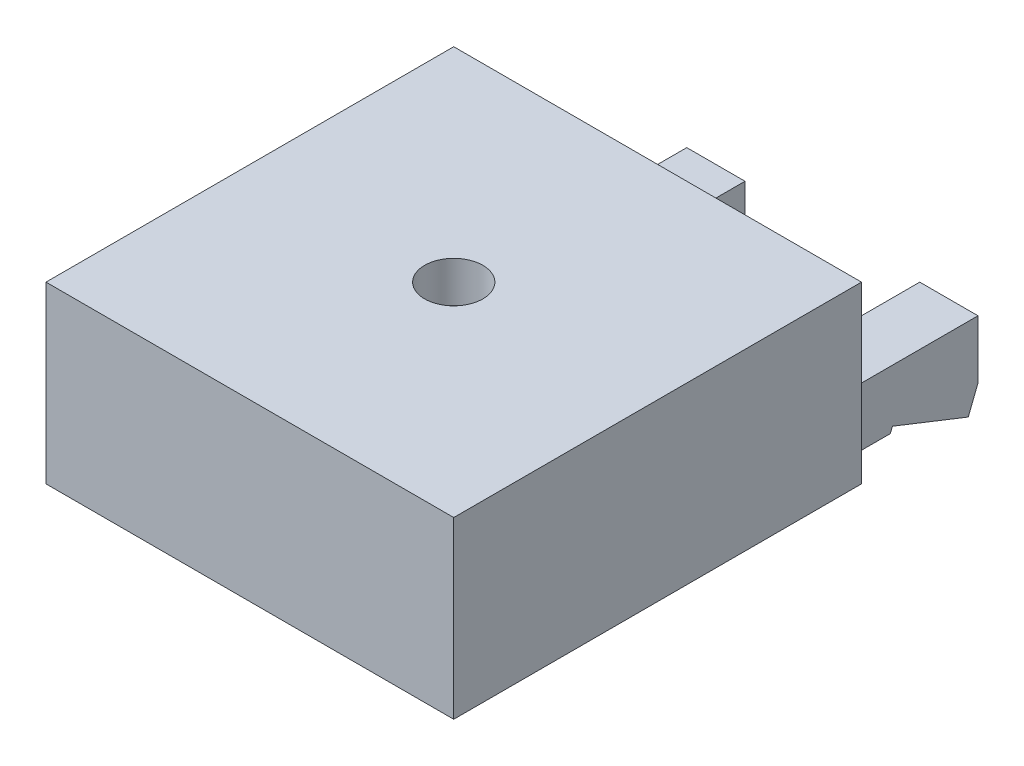
ISO-10303-21;
HEADER;
FILE_DESCRIPTION(('STEP AP214'),'2;1');
FILE_NAME('part.step','',(''),(''),'','','');
FILE_SCHEMA(('AUTOMOTIVE_DESIGN { 1 0 10303 214 1 1 1 1 }'));
ENDSEC;
DATA;
#1=APPLICATION_CONTEXT('core data for automotive mechanical design processes');
#2=APPLICATION_PROTOCOL_DEFINITION('international standard','automotive_design',2000,#1);
#3=PRODUCT_CONTEXT('',#1,'mechanical');
#4=PRODUCT('Part','Part','',(#3));
#5=PRODUCT_RELATED_PRODUCT_CATEGORY('part','',(#4));
#6=PRODUCT_DEFINITION_FORMATION('','',#4);
#7=PRODUCT_DEFINITION_CONTEXT('part definition',#1,'design');
#8=PRODUCT_DEFINITION('design','',#6,#7);
#9=PRODUCT_DEFINITION_SHAPE('','',#8);
#10=(LENGTH_UNIT() NAMED_UNIT(*) SI_UNIT(.MILLI.,.METRE.));
#11=(NAMED_UNIT(*) PLANE_ANGLE_UNIT() SI_UNIT($,.RADIAN.));
#12=(NAMED_UNIT(*) SI_UNIT($,.STERADIAN.) SOLID_ANGLE_UNIT());
#13=UNCERTAINTY_MEASURE_WITH_UNIT(LENGTH_MEASURE(1.E-05),#10,'distance_accuracy_value','');
#14=(GEOMETRIC_REPRESENTATION_CONTEXT(3) GLOBAL_UNCERTAINTY_ASSIGNED_CONTEXT((#13)) GLOBAL_UNIT_ASSIGNED_CONTEXT((#10,
#11,#12)) REPRESENTATION_CONTEXT('',''));
#15=CARTESIAN_POINT('',(0.,0.,0.));
#16=DIRECTION('',(0.,0.,1.));
#17=DIRECTION('',(1.,0.,0.));
#18=AXIS2_PLACEMENT_3D('',#15,#16,#17);
#19=CARTESIAN_POINT('',(0.,30.,-70.));
#20=DIRECTION('',(0.,0.,1.));
#21=DIRECTION('',(1.,0.,0.));
#22=AXIS2_PLACEMENT_3D('',#19,#20,#21);
#23=PLANE('',#22);
#24=DIRECTION('',(0.,1.,0.));
#25=VECTOR('',#24,1.);
#26=CARTESIAN_POINT('',(10.0049669889349,-5.,-70.));
#27=LINE('',#26,#25);
#28=CARTESIAN_POINT('',(10.0049669889349,0.,-70.));
#29=VERTEX_POINT('',#28);
#30=CARTESIAN_POINT('',(10.0049669889349,5.,-70.));
#31=VERTEX_POINT('',#30);
#32=EDGE_CURVE('E262',#29,#31,#27,.T.);
#33=ORIENTED_EDGE('',*,*,#32,.F.);
#34=DIRECTION('',(-1.,0.,0.));
#35=VECTOR('',#34,1.);
#36=CARTESIAN_POINT('',(0.,0.,-70.));
#37=LINE('',#36,#35);
#38=CARTESIAN_POINT('',(0.,0.,-70.));
#39=VERTEX_POINT('',#38);
#40=EDGE_CURVE('E377',#29,#39,#37,.T.);
#41=ORIENTED_EDGE('',*,*,#40,.T.);
#42=DIRECTION('',(0.,-1.,0.));
#43=VECTOR('',#42,1.);
#44=CARTESIAN_POINT('',(0.,30.,-70.));
#45=LINE('',#44,#43);
#46=CARTESIAN_POINT('',(0.,30.,-70.));
#47=VERTEX_POINT('',#46);
#48=EDGE_CURVE('E370',#47,#39,#45,.T.);
#49=ORIENTED_EDGE('',*,*,#48,.F.);
#50=DIRECTION('',(-1.,0.,0.));
#51=VECTOR('',#50,1.);
#52=CARTESIAN_POINT('',(0.,30.,-70.));
#53=LINE('',#52,#51);
#54=CARTESIAN_POINT('',(70.,30.,-70.));
#55=VERTEX_POINT('',#54);
#56=EDGE_CURVE('E368',#55,#47,#53,.T.);
#57=ORIENTED_EDGE('',*,*,#56,.F.);
#58=DIRECTION('',(0.,-1.,0.));
#59=VECTOR('',#58,1.);
#60=CARTESIAN_POINT('',(70.,30.,-70.));
#61=LINE('',#60,#59);
#62=CARTESIAN_POINT('',(70.,0.,-70.));
#63=VERTEX_POINT('',#62);
#64=EDGE_CURVE('E383',#55,#63,#61,.T.);
#65=ORIENTED_EDGE('',*,*,#64,.T.);
#66=CARTESIAN_POINT('',(60.0049669889349,0.,-70.));
#67=VERTEX_POINT('',#66);
#68=EDGE_CURVE('E364',#63,#67,#37,.T.);
#69=ORIENTED_EDGE('',*,*,#68,.T.);
#70=DIRECTION('',(0.,1.,0.));
#71=VECTOR('',#70,1.);
#72=CARTESIAN_POINT('',(60.0049669889349,-5.,-70.));
#73=LINE('',#72,#71);
#74=CARTESIAN_POINT('',(60.0049669889349,5.,-70.));
#75=VERTEX_POINT('',#74);
#76=EDGE_CURVE('E44',#67,#75,#73,.T.);
#77=ORIENTED_EDGE('',*,*,#76,.T.);
#78=DIRECTION('',(-1.,0.,0.));
#79=VECTOR('',#78,1.);
#80=CARTESIAN_POINT('',(50.0049669889349,5.,-70.));
#81=LINE('',#80,#79);
#82=CARTESIAN_POINT('',(50.0049669889349,5.,-70.));
#83=VERTEX_POINT('',#82);
#84=EDGE_CURVE('E297',#75,#83,#81,.T.);
#85=ORIENTED_EDGE('',*,*,#84,.T.);
#86=DIRECTION('',(0.,1.,0.));
#87=VECTOR('',#86,1.);
#88=CARTESIAN_POINT('',(50.0049669889349,-5.,-70.));
#89=LINE('',#88,#87);
#90=CARTESIAN_POINT('',(50.0049669889349,0.,-70.));
#91=VERTEX_POINT('',#90);
#92=EDGE_CURVE('E11',#91,#83,#89,.T.);
#93=ORIENTED_EDGE('',*,*,#92,.F.);
#94=CARTESIAN_POINT('',(20.0049669889349,0.,-70.));
#95=VERTEX_POINT('',#94);
#96=EDGE_CURVE('E408',#91,#95,#37,.T.);
#97=ORIENTED_EDGE('',*,*,#96,.T.);
#98=DIRECTION('',(0.,1.,0.));
#99=VECTOR('',#98,1.);
#100=CARTESIAN_POINT('',(20.0049669889349,-5.,-70.));
#101=LINE('',#100,#99);
#102=CARTESIAN_POINT('',(20.0049669889349,5.,-70.));
#103=VERTEX_POINT('',#102);
#104=EDGE_CURVE('E61',#95,#103,#101,.T.);
#105=ORIENTED_EDGE('',*,*,#104,.T.);
#106=DIRECTION('',(-1.,0.,0.));
#107=VECTOR('',#106,1.);
#108=CARTESIAN_POINT('',(10.0049669889349,5.,-70.));
#109=LINE('',#108,#107);
#110=EDGE_CURVE('E255',#103,#31,#109,.T.);
#111=ORIENTED_EDGE('',*,*,#110,.T.);
#112=EDGE_LOOP('',(#33,#41,#49,#57,#65,#69,#77,#85,#93,#97,#105,#111));
#113=FACE_BOUND('',#112,.T.);
#114=ADVANCED_FACE('F35',(#113),#23,.F.);
#115=CARTESIAN_POINT('',(0.,-5.,0.));
#116=DIRECTION('',(0.,-1.,0.));
#117=DIRECTION('',(0.,0.,-1.));
#118=AXIS2_PLACEMENT_3D('',#115,#116,#117);
#119=PLANE('',#118);
#120=DIRECTION('',(0.964913528572328,0.,-0.262567862424362));
#121=VECTOR('',#120,1.);
#122=CARTESIAN_POINT('',(-18.0655924580302,-5.,-66.3894446314775));
#123=LINE('',#122,#121);
#124=CARTESIAN_POINT('',(50.1305748029924,-5.,-84.9466741997629));
#125=VERTEX_POINT('',#124);
#126=CARTESIAN_POINT('',(50.3265423734166,-5.,-85.));
#127=VERTEX_POINT('',#126);
#128=EDGE_CURVE('E229',#125,#127,#123,.T.);
#129=ORIENTED_EDGE('',*,*,#128,.F.);
#130=DIRECTION('',(1.,0.,0.));
#131=VECTOR('',#130,1.);
#132=CARTESIAN_POINT('',(0.,-5.,-84.9466741997628));
#133=LINE('',#132,#131);
#134=CARTESIAN_POINT('',(60.0049669889349,-5.00000000000001,-84.9466741997629));
#135=VERTEX_POINT('',#134);
#136=EDGE_CURVE('E206',#125,#135,#133,.T.);
#137=ORIENTED_EDGE('',*,*,#136,.T.);
#138=DIRECTION('',(0.,0.,1.));
#139=VECTOR('',#138,1.);
#140=CARTESIAN_POINT('',(60.0049669889349,-5.,-70.));
#141=LINE('',#140,#139);
#142=CARTESIAN_POINT('',(60.0049669889349,-5.,-70.));
#143=VERTEX_POINT('',#142);
#144=EDGE_CURVE('E223',#135,#143,#141,.T.);
#145=ORIENTED_EDGE('',*,*,#144,.T.);
#146=DIRECTION('',(-1.,0.,0.));
#147=VECTOR('',#146,1.);
#148=CARTESIAN_POINT('',(50.0049669889349,-5.,-70.));
#149=LINE('',#148,#147);
#150=CARTESIAN_POINT('',(50.0049669889349,-5.,-70.));
#151=VERTEX_POINT('',#150);
#152=EDGE_CURVE('E300',#143,#151,#149,.T.);
#153=ORIENTED_EDGE('',*,*,#152,.T.);
#154=DIRECTION('',(0.,0.,-1.));
#155=VECTOR('',#154,1.);
#156=CARTESIAN_POINT('',(50.0049669889349,-5.,-70.));
#157=LINE('',#156,#155);
#158=CARTESIAN_POINT('',(50.0049669889349,-5.,-85.));
#159=VERTEX_POINT('',#158);
#160=EDGE_CURVE('E293',#151,#159,#157,.T.);
#161=ORIENTED_EDGE('',*,*,#160,.T.);
#162=DIRECTION('',(1.,0.,0.));
#163=VECTOR('',#162,1.);
#164=CARTESIAN_POINT('',(50.0049669889349,-5.,-85.));
#165=LINE('',#164,#163);
#166=EDGE_CURVE('E288',#159,#127,#165,.T.);
#167=ORIENTED_EDGE('',*,*,#166,.T.);
#168=EDGE_LOOP('',(#129,#137,#145,#153,#161,#167));
#169=FACE_BOUND('',#168,.T.);
#170=ADVANCED_FACE('F436',(#169),#119,.T.);
#171=CARTESIAN_POINT('',(0.,30.,0.));
#172=DIRECTION('',(1.,0.,0.));
#173=DIRECTION('',(0.,0.,-1.));
#174=AXIS2_PLACEMENT_3D('',#171,#172,#173);
#175=PLANE('',#174);
#176=DIRECTION('',(0.,0.,1.));
#177=VECTOR('',#176,1.);
#178=CARTESIAN_POINT('',(0.,0.,0.));
#179=LINE('',#178,#177);
#180=CARTESIAN_POINT('',(0.,0.,0.));
#181=VERTEX_POINT('',#180);
#182=EDGE_CURVE('E353',#39,#181,#179,.T.);
#183=ORIENTED_EDGE('',*,*,#182,.T.);
#184=DIRECTION('',(0.,-1.,0.));
#185=VECTOR('',#184,1.);
#186=CARTESIAN_POINT('',(0.,30.,0.));
#187=LINE('',#186,#185);
#188=CARTESIAN_POINT('',(0.,30.,0.));
#189=VERTEX_POINT('',#188);
#190=EDGE_CURVE('E39',#189,#181,#187,.T.);
#191=ORIENTED_EDGE('',*,*,#190,.F.);
#192=DIRECTION('',(0.,0.,1.));
#193=VECTOR('',#192,1.);
#194=CARTESIAN_POINT('',(0.,30.,0.));
#195=LINE('',#194,#193);
#196=EDGE_CURVE('E360',#47,#189,#195,.T.);
#197=ORIENTED_EDGE('',*,*,#196,.F.);
#198=ORIENTED_EDGE('',*,*,#48,.T.);
#199=EDGE_LOOP('',(#183,#191,#197,#198));
#200=FACE_BOUND('',#199,.T.);
#201=ADVANCED_FACE('F37',(#200),#175,.F.);
#202=CARTESIAN_POINT('',(0.,30.,0.));
#203=DIRECTION('',(0.,0.,-1.));
#204=DIRECTION('',(-1.,0.,0.));
#205=AXIS2_PLACEMENT_3D('',#202,#203,#204);
#206=PLANE('',#205);
#207=DIRECTION('',(1.,0.,0.));
#208=VECTOR('',#207,1.);
#209=CARTESIAN_POINT('',(0.,0.,0.));
#210=LINE('',#209,#208);
#211=CARTESIAN_POINT('',(70.,0.,0.));
#212=VERTEX_POINT('',#211);
#213=EDGE_CURVE('E373',#181,#212,#210,.T.);
#214=ORIENTED_EDGE('',*,*,#213,.T.);
#215=DIRECTION('',(0.,-1.,0.));
#216=VECTOR('',#215,1.);
#217=CARTESIAN_POINT('',(70.,30.,0.));
#218=LINE('',#217,#216);
#219=CARTESIAN_POINT('',(70.,30.,0.));
#220=VERTEX_POINT('',#219);
#221=EDGE_CURVE('E385',#220,#212,#218,.T.);
#222=ORIENTED_EDGE('',*,*,#221,.F.);
#223=DIRECTION('',(1.,0.,0.));
#224=VECTOR('',#223,1.);
#225=CARTESIAN_POINT('',(0.,30.,0.));
#226=LINE('',#225,#224);
#227=EDGE_CURVE('E363',#189,#220,#226,.T.);
#228=ORIENTED_EDGE('',*,*,#227,.F.);
#229=ORIENTED_EDGE('',*,*,#190,.T.);
#230=EDGE_LOOP('',(#214,#222,#228,#229));
#231=FACE_BOUND('',#230,.T.);
#232=ADVANCED_FACE('F418',(#231),#206,.F.);
#233=CARTESIAN_POINT('',(70.,30.,0.));
#234=DIRECTION('',(-1.,0.,0.));
#235=DIRECTION('',(0.,0.,1.));
#236=AXIS2_PLACEMENT_3D('',#233,#234,#235);
#237=PLANE('',#236);
#238=DIRECTION('',(0.,0.,-1.));
#239=VECTOR('',#238,1.);
#240=CARTESIAN_POINT('',(70.,0.,0.));
#241=LINE('',#240,#239);
#242=EDGE_CURVE('E375',#212,#63,#241,.T.);
#243=ORIENTED_EDGE('',*,*,#242,.T.);
#244=ORIENTED_EDGE('',*,*,#64,.F.);
#245=DIRECTION('',(0.,0.,-1.));
#246=VECTOR('',#245,1.);
#247=CARTESIAN_POINT('',(70.,30.,0.));
#248=LINE('',#247,#246);
#249=EDGE_CURVE('E366',#220,#55,#248,.T.);
#250=ORIENTED_EDGE('',*,*,#249,.F.);
#251=ORIENTED_EDGE('',*,*,#221,.T.);
#252=EDGE_LOOP('',(#243,#244,#250,#251));
#253=FACE_BOUND('',#252,.T.);
#254=ADVANCED_FACE('F420',(#253),#237,.F.);
#255=CARTESIAN_POINT('',(0.,30.,0.));
#256=DIRECTION('',(0.,-1.,0.));
#257=DIRECTION('',(0.,0.,-1.));
#258=AXIS2_PLACEMENT_3D('',#255,#256,#257);
#259=PLANE('',#258);
#260=CARTESIAN_POINT('',(35.,30.,-35.));
#261=DIRECTION('',(0.,-1.,0.));
#262=DIRECTION('',(0.,0.,-1.));
#263=AXIS2_PLACEMENT_3D('',#260,#261,#262);
#264=CIRCLE('',#263,5.);
#265=CARTESIAN_POINT('',(35.,30.,-40.));
#266=VERTEX_POINT('',#265);
#267=EDGE_CURVE('E324',#266,#266,#264,.T.);
#268=ORIENTED_EDGE('',*,*,#267,.T.);
#269=EDGE_LOOP('',(#268));
#270=FACE_BOUND('',#269,.T.);
#271=ORIENTED_EDGE('',*,*,#196,.T.);
#272=ORIENTED_EDGE('',*,*,#227,.T.);
#273=ORIENTED_EDGE('',*,*,#249,.T.);
#274=ORIENTED_EDGE('',*,*,#56,.T.);
#275=EDGE_LOOP('',(#271,#272,#273,#274));
#276=FACE_BOUND('',#275,.T.);
#277=ADVANCED_FACE('F422',(#270,#276),#259,.F.);
#278=CARTESIAN_POINT('',(0.,0.,0.));
#279=DIRECTION('',(0.,-1.,0.));
#280=DIRECTION('',(0.,0.,-1.));
#281=AXIS2_PLACEMENT_3D('',#278,#279,#280);
#282=PLANE('',#281);
#283=DIRECTION('',(0.,0.,-1.));
#284=VECTOR('',#283,1.);
#285=CARTESIAN_POINT('',(4.99999999999997,0.,-5.));
#286=LINE('',#285,#284);
#287=CARTESIAN_POINT('',(4.99999999999997,0.,-5.));
#288=VERTEX_POINT('',#287);
#289=CARTESIAN_POINT('',(4.99999999999997,0.,-65.));
#290=VERTEX_POINT('',#289);
#291=EDGE_CURVE('E327',#288,#290,#286,.T.);
#292=ORIENTED_EDGE('',*,*,#291,.F.);
#293=DIRECTION('',(-1.,0.,0.));
#294=VECTOR('',#293,1.);
#295=CARTESIAN_POINT('',(4.99999999999997,0.,-5.));
#296=LINE('',#295,#294);
#297=CARTESIAN_POINT('',(65.,0.,-4.99999999999999));
#298=VERTEX_POINT('',#297);
#299=EDGE_CURVE('E332',#298,#288,#296,.T.);
#300=ORIENTED_EDGE('',*,*,#299,.F.);
#301=DIRECTION('',(0.,0.,1.));
#302=VECTOR('',#301,1.);
#303=CARTESIAN_POINT('',(65.,0.,-4.99999999999999));
#304=LINE('',#303,#302);
#305=CARTESIAN_POINT('',(65.,0.,-65.));
#306=VERTEX_POINT('',#305);
#307=EDGE_CURVE('E346',#306,#298,#304,.T.);
#308=ORIENTED_EDGE('',*,*,#307,.F.);
#309=DIRECTION('',(1.,0.,0.));
#310=VECTOR('',#309,1.);
#311=CARTESIAN_POINT('',(4.99999999999997,0.,-65.));
#312=LINE('',#311,#310);
#313=EDGE_CURVE('E343',#290,#306,#312,.T.);
#314=ORIENTED_EDGE('',*,*,#313,.F.);
#315=EDGE_LOOP('',(#292,#300,#308,#314));
#316=FACE_BOUND('',#315,.T.);
#317=ORIENTED_EDGE('',*,*,#182,.F.);
#318=ORIENTED_EDGE('',*,*,#40,.F.);
#319=EDGE_CURVE('E409',#95,#29,#37,.T.);
#320=ORIENTED_EDGE('',*,*,#319,.F.);
#321=ORIENTED_EDGE('',*,*,#96,.F.);
#322=EDGE_CURVE('E380',#67,#91,#37,.T.);
#323=ORIENTED_EDGE('',*,*,#322,.F.);
#324=ORIENTED_EDGE('',*,*,#68,.F.);
#325=ORIENTED_EDGE('',*,*,#242,.F.);
#326=ORIENTED_EDGE('',*,*,#213,.F.);
#327=EDGE_LOOP('',(#317,#318,#320,#321,#323,#324,#325,#326));
#328=FACE_BOUND('',#327,.T.);
#329=ADVANCED_FACE('F407',(#316,#328),#282,.T.);
#330=CARTESIAN_POINT('',(4.99999999999997,23.,-5.));
#331=DIRECTION('',(-1.,0.,0.));
#332=DIRECTION('',(0.,0.,1.));
#333=AXIS2_PLACEMENT_3D('',#330,#331,#332);
#334=PLANE('',#333);
#335=ORIENTED_EDGE('',*,*,#291,.T.);
#336=DIRECTION('',(0.,-1.,0.));
#337=VECTOR('',#336,1.);
#338=CARTESIAN_POINT('',(4.99999999999997,23.,-65.));
#339=LINE('',#338,#337);
#340=CARTESIAN_POINT('',(4.99999999999997,23.,-65.));
#341=VERTEX_POINT('',#340);
#342=EDGE_CURVE('E341',#341,#290,#339,.T.);
#343=ORIENTED_EDGE('',*,*,#342,.F.);
#344=DIRECTION('',(0.,0.,-1.));
#345=VECTOR('',#344,1.);
#346=CARTESIAN_POINT('',(4.99999999999997,23.,-5.));
#347=LINE('',#346,#345);
#348=CARTESIAN_POINT('',(4.99999999999997,23.,-5.));
#349=VERTEX_POINT('',#348);
#350=EDGE_CURVE('E328',#349,#341,#347,.T.);
#351=ORIENTED_EDGE('',*,*,#350,.F.);
#352=DIRECTION('',(0.,-1.,0.));
#353=VECTOR('',#352,1.);
#354=CARTESIAN_POINT('',(4.99999999999997,23.,-5.));
#355=LINE('',#354,#353);
#356=EDGE_CURVE('E351',#349,#288,#355,.T.);
#357=ORIENTED_EDGE('',*,*,#356,.T.);
#358=EDGE_LOOP('',(#335,#343,#351,#357));
#359=FACE_BOUND('',#358,.T.);
#360=ADVANCED_FACE('F430',(#359),#334,.F.);
#361=CARTESIAN_POINT('',(4.99999999999997,23.,-5.));
#362=DIRECTION('',(0.,0.,1.));
#363=DIRECTION('',(1.,0.,0.));
#364=AXIS2_PLACEMENT_3D('',#361,#362,#363);
#365=PLANE('',#364);
#366=ORIENTED_EDGE('',*,*,#299,.T.);
#367=ORIENTED_EDGE('',*,*,#356,.F.);
#368=DIRECTION('',(-1.,0.,0.));
#369=VECTOR('',#368,1.);
#370=CARTESIAN_POINT('',(4.99999999999997,23.,-5.));
#371=LINE('',#370,#369);
#372=CARTESIAN_POINT('',(65.,23.,-4.99999999999999));
#373=VERTEX_POINT('',#372);
#374=EDGE_CURVE('E338',#373,#349,#371,.T.);
#375=ORIENTED_EDGE('',*,*,#374,.F.);
#376=DIRECTION('',(0.,-1.,0.));
#377=VECTOR('',#376,1.);
#378=CARTESIAN_POINT('',(65.,23.,-4.99999999999999));
#379=LINE('',#378,#377);
#380=EDGE_CURVE('E354',#373,#298,#379,.T.);
#381=ORIENTED_EDGE('',*,*,#380,.T.);
#382=EDGE_LOOP('',(#366,#367,#375,#381));
#383=FACE_BOUND('',#382,.T.);
#384=ADVANCED_FACE('F575',(#383),#365,.F.);
#385=CARTESIAN_POINT('',(65.,23.,-4.99999999999999));
#386=DIRECTION('',(1.,0.,0.));
#387=DIRECTION('',(0.,0.,-1.));
#388=AXIS2_PLACEMENT_3D('',#385,#386,#387);
#389=PLANE('',#388);
#390=ORIENTED_EDGE('',*,*,#307,.T.);
#391=ORIENTED_EDGE('',*,*,#380,.F.);
#392=DIRECTION('',(0.,0.,1.));
#393=VECTOR('',#392,1.);
#394=CARTESIAN_POINT('',(65.,23.,-4.99999999999999));
#395=LINE('',#394,#393);
#396=CARTESIAN_POINT('',(65.,23.,-65.));
#397=VERTEX_POINT('',#396);
#398=EDGE_CURVE('E335',#397,#373,#395,.T.);
#399=ORIENTED_EDGE('',*,*,#398,.F.);
#400=DIRECTION('',(0.,-1.,0.));
#401=VECTOR('',#400,1.);
#402=CARTESIAN_POINT('',(65.,23.,-65.));
#403=LINE('',#402,#401);
#404=EDGE_CURVE('E356',#397,#306,#403,.T.);
#405=ORIENTED_EDGE('',*,*,#404,.T.);
#406=EDGE_LOOP('',(#390,#391,#399,#405));
#407=FACE_BOUND('',#406,.T.);
#408=ADVANCED_FACE('F578',(#407),#389,.F.);
#409=CARTESIAN_POINT('',(4.99999999999997,23.,-65.));
#410=DIRECTION('',(0.,0.,-1.));
#411=DIRECTION('',(-1.,0.,0.));
#412=AXIS2_PLACEMENT_3D('',#409,#410,#411);
#413=PLANE('',#412);
#414=ORIENTED_EDGE('',*,*,#313,.T.);
#415=ORIENTED_EDGE('',*,*,#404,.F.);
#416=DIRECTION('',(1.,0.,0.));
#417=VECTOR('',#416,1.);
#418=CARTESIAN_POINT('',(4.99999999999997,23.,-65.));
#419=LINE('',#418,#417);
#420=EDGE_CURVE('E331',#341,#397,#419,.T.);
#421=ORIENTED_EDGE('',*,*,#420,.F.);
#422=ORIENTED_EDGE('',*,*,#342,.T.);
#423=EDGE_LOOP('',(#414,#415,#421,#422));
#424=FACE_BOUND('',#423,.T.);
#425=ADVANCED_FACE('F573',(#424),#413,.F.);
#426=CARTESIAN_POINT('',(0.,23.,0.));
#427=DIRECTION('',(0.,-1.,0.));
#428=DIRECTION('',(0.,0.,-1.));
#429=AXIS2_PLACEMENT_3D('',#426,#427,#428);
#430=PLANE('',#429);
#431=CARTESIAN_POINT('',(35.,23.,-35.));
#432=DIRECTION('',(0.,-1.,0.));
#433=DIRECTION('',(0.,0.,-1.));
#434=AXIS2_PLACEMENT_3D('',#431,#432,#433);
#435=CIRCLE('',#434,5.);
#436=CARTESIAN_POINT('',(35.,23.,-40.));
#437=VERTEX_POINT('',#436);
#438=EDGE_CURVE('E321',#437,#437,#435,.T.);
#439=ORIENTED_EDGE('',*,*,#438,.F.);
#440=EDGE_LOOP('',(#439));
#441=FACE_BOUND('',#440,.T.);
#442=ORIENTED_EDGE('',*,*,#350,.T.);
#443=ORIENTED_EDGE('',*,*,#420,.T.);
#444=ORIENTED_EDGE('',*,*,#398,.T.);
#445=ORIENTED_EDGE('',*,*,#374,.T.);
#446=EDGE_LOOP('',(#442,#443,#444,#445));
#447=FACE_BOUND('',#446,.T.);
#448=ADVANCED_FACE('F569',(#441,#447),#430,.T.);
#449=CARTESIAN_POINT('',(35.,46.,-35.));
#450=DIRECTION('',(0.,-1.,0.));
#451=DIRECTION('',(0.,0.,-1.));
#452=AXIS2_PLACEMENT_3D('',#449,#450,#451);
#453=CYLINDRICAL_SURFACE('',#452,5.);
#454=ORIENTED_EDGE('',*,*,#438,.T.);
#455=EDGE_LOOP('',(#454));
#456=FACE_BOUND('',#455,.T.);
#457=ORIENTED_EDGE('',*,*,#267,.F.);
#458=EDGE_LOOP('',(#457));
#459=FACE_BOUND('',#458,.T.);
#460=ADVANCED_FACE('F563',(#456,#459),#453,.F.);
#461=CARTESIAN_POINT('',(50.0049669889349,-5.,-70.));
#462=DIRECTION('',(0.,0.,-1.));
#463=DIRECTION('',(-1.,0.,0.));
#464=AXIS2_PLACEMENT_3D('',#461,#462,#463);
#465=PLANE('',#464);
#466=EDGE_CURVE('E312',#143,#67,#73,.T.);
#467=ORIENTED_EDGE('',*,*,#466,.T.);
#468=ORIENTED_EDGE('',*,*,#322,.T.);
#469=EDGE_CURVE('E46',#151,#91,#89,.T.);
#470=ORIENTED_EDGE('',*,*,#469,.F.);
#471=ORIENTED_EDGE('',*,*,#152,.F.);
#472=EDGE_LOOP('',(#467,#468,#470,#471));
#473=FACE_BOUND('',#472,.T.);
#474=ADVANCED_FACE('F402',(#473),#465,.F.);
#475=CARTESIAN_POINT('',(50.0049669889349,-5.,-70.));
#476=DIRECTION('',(1.,0.,0.));
#477=DIRECTION('',(0.,0.,-1.));
#478=AXIS2_PLACEMENT_3D('',#475,#476,#477);
#479=PLANE('',#478);
#480=DIRECTION('',(0.,0.,-1.));
#481=VECTOR('',#480,1.);
#482=CARTESIAN_POINT('',(50.0049669889349,5.,-70.));
#483=LINE('',#482,#481);
#484=CARTESIAN_POINT('',(50.0049669889349,5.,-100.));
#485=VERTEX_POINT('',#484);
#486=EDGE_CURVE('E292',#83,#485,#483,.T.);
#487=ORIENTED_EDGE('',*,*,#486,.T.);
#488=DIRECTION('',(0.,1.,0.));
#489=VECTOR('',#488,1.);
#490=CARTESIAN_POINT('',(50.0049669889349,-5.,-100.));
#491=LINE('',#490,#489);
#492=CARTESIAN_POINT('',(50.0049669889349,-5.,-100.));
#493=VERTEX_POINT('',#492);
#494=EDGE_CURVE('E318',#493,#485,#491,.T.);
#495=ORIENTED_EDGE('',*,*,#494,.F.);
#496=DIRECTION('',(0.,-0.930027037598525,0.367491101029279));
#497=VECTOR('',#496,1.);
#498=CARTESIAN_POINT('',(50.0049669889349,-34.8529145500866,-88.2039123665993));
#499=LINE('',#498,#497);
#500=CARTESIAN_POINT('',(50.0049669889349,-10.1565572807306,-97.9624367507536));
#501=VERTEX_POINT('',#500);
#502=EDGE_CURVE('E285',#493,#501,#499,.T.);
#503=ORIENTED_EDGE('',*,*,#502,.T.);
#504=DIRECTION('',(0.,0.369633954876696,0.929177453128418));
#505=VECTOR('',#504,1.);
#506=CARTESIAN_POINT('',(50.0049669889349,24.8768669294685,-9.89620946690133));
#507=LINE('',#506,#505);
#508=EDGE_CURVE('E283',#501,#159,#507,.T.);
#509=ORIENTED_EDGE('',*,*,#508,.T.);
#510=ORIENTED_EDGE('',*,*,#160,.F.);
#511=ORIENTED_EDGE('',*,*,#469,.T.);
#512=ORIENTED_EDGE('',*,*,#92,.T.);
#513=EDGE_LOOP('',(#487,#495,#503,#509,#510,#511,#512));
#514=FACE_BOUND('',#513,.T.);
#515=ADVANCED_FACE('F466',(#514),#479,.F.);
#516=CARTESIAN_POINT('',(50.0049669889349,-5.,-100.));
#517=DIRECTION('',(0.,0.,1.));
#518=DIRECTION('',(1.,0.,0.));
#519=AXIS2_PLACEMENT_3D('',#516,#517,#518);
#520=PLANE('',#519);
#521=DIRECTION('',(1.,0.,0.));
#522=VECTOR('',#521,1.);
#523=CARTESIAN_POINT('',(50.0049669889349,5.,-100.));
#524=LINE('',#523,#522);
#525=CARTESIAN_POINT('',(60.0049669889349,5.,-100.));
#526=VERTEX_POINT('',#525);
#527=EDGE_CURVE('E304',#485,#526,#524,.T.);
#528=ORIENTED_EDGE('',*,*,#527,.T.);
#529=DIRECTION('',(0.,1.,0.));
#530=VECTOR('',#529,1.);
#531=CARTESIAN_POINT('',(60.0049669889349,-5.,-100.));
#532=LINE('',#531,#530);
#533=CARTESIAN_POINT('',(60.0049669889349,-5.,-100.));
#534=VERTEX_POINT('',#533);
#535=EDGE_CURVE('E315',#534,#526,#532,.T.);
#536=ORIENTED_EDGE('',*,*,#535,.F.);
#537=DIRECTION('',(1.,0.,0.));
#538=VECTOR('',#537,1.);
#539=CARTESIAN_POINT('',(50.0049669889349,-5.,-100.));
#540=LINE('',#539,#538);
#541=EDGE_CURVE('E296',#493,#534,#540,.T.);
#542=ORIENTED_EDGE('',*,*,#541,.F.);
#543=ORIENTED_EDGE('',*,*,#494,.T.);
#544=EDGE_LOOP('',(#528,#536,#542,#543));
#545=FACE_BOUND('',#544,.T.);
#546=ADVANCED_FACE('F470',(#545),#520,.F.);
#547=CARTESIAN_POINT('',(60.0049669889349,-5.,-70.));
#548=DIRECTION('',(-1.,0.,0.));
#549=DIRECTION('',(0.,0.,1.));
#550=AXIS2_PLACEMENT_3D('',#547,#548,#549);
#551=PLANE('',#550);
#552=DIRECTION('',(0.,-0.930027037598525,0.367491101029278));
#553=VECTOR('',#552,1.);
#554=CARTESIAN_POINT('',(60.0049669889349,-4.08165482872218,-85.3095493254036));
#555=LINE('',#554,#553);
#556=CARTESIAN_POINT('',(60.0049669889349,-4.08165482872218,-85.3095493254036));
#557=VERTEX_POINT('',#556);
#558=EDGE_CURVE('E204',#557,#135,#555,.T.);
#559=ORIENTED_EDGE('',*,*,#558,.F.);
#560=DIRECTION('',(0.,-0.367491101029279,-0.930027037598525));
#561=VECTOR('',#560,1.);
#562=CARTESIAN_POINT('',(60.0049669889349,-4.08165482872218,-85.3095493254036));
#563=LINE('',#562,#561);
#564=CARTESIAN_POINT('',(60.0049669889349,-9.22653024313209,-98.3299278517829));
#565=VERTEX_POINT('',#564);
#566=EDGE_CURVE('E212',#557,#565,#563,.T.);
#567=ORIENTED_EDGE('',*,*,#566,.T.);
#568=DIRECTION('',(0.,-0.930027037598525,0.367491101029279));
#569=VECTOR('',#568,1.);
#570=CARTESIAN_POINT('',(60.0049669889349,-34.8529145500866,-88.2039123665993));
#571=LINE('',#570,#569);
#572=EDGE_CURVE('E282',#534,#565,#571,.T.);
#573=ORIENTED_EDGE('',*,*,#572,.F.);
#574=ORIENTED_EDGE('',*,*,#535,.T.);
#575=DIRECTION('',(0.,0.,1.));
#576=VECTOR('',#575,1.);
#577=CARTESIAN_POINT('',(60.0049669889349,5.,-70.));
#578=LINE('',#577,#576);
#579=EDGE_CURVE('E306',#526,#75,#578,.T.);
#580=ORIENTED_EDGE('',*,*,#579,.T.);
#581=ORIENTED_EDGE('',*,*,#76,.F.);
#582=ORIENTED_EDGE('',*,*,#466,.F.);
#583=ORIENTED_EDGE('',*,*,#144,.F.);
#584=EDGE_LOOP('',(#559,#567,#573,#574,#580,#581,#582,#583));
#585=FACE_BOUND('',#584,.T.);
#586=ADVANCED_FACE('F221',(#585),#551,.F.);
#587=CARTESIAN_POINT('',(0.,5.,0.));
#588=DIRECTION('',(0.,-1.,0.));
#589=DIRECTION('',(0.,0.,-1.));
#590=AXIS2_PLACEMENT_3D('',#587,#588,#589);
#591=PLANE('',#590);
#592=ORIENTED_EDGE('',*,*,#486,.F.);
#593=ORIENTED_EDGE('',*,*,#84,.F.);
#594=ORIENTED_EDGE('',*,*,#579,.F.);
#595=ORIENTED_EDGE('',*,*,#527,.F.);
#596=EDGE_LOOP('',(#592,#593,#594,#595));
#597=FACE_BOUND('',#596,.T.);
#598=ADVANCED_FACE('F483',(#597),#591,.F.);
#599=CARTESIAN_POINT('',(50.0049669889349,24.8768669294685,-9.89620946690133));
#600=DIRECTION('',(0.,0.929177453128418,-0.369633954876696));
#601=DIRECTION('',(0.,0.369633954876696,0.929177453128418));
#602=AXIS2_PLACEMENT_3D('',#599,#600,#601);
#603=PLANE('',#602);
#604=ORIENTED_EDGE('',*,*,#508,.F.);
#605=DIRECTION('',(0.023045145648647,0.369535789474442,0.92893068716645));
#606=VECTOR('',#605,1.);
#607=CARTESIAN_POINT('',(52.1885757755975,24.8582614227523,-9.94297956774478));
#608=LINE('',#607,#606);
#609=EDGE_CURVE('E218',#501,#127,#608,.T.);
#610=ORIENTED_EDGE('',*,*,#609,.T.);
#611=ORIENTED_EDGE('',*,*,#166,.F.);
#612=EDGE_LOOP('',(#604,#610,#611));
#613=FACE_BOUND('',#612,.T.);
#614=ADVANCED_FACE('F491',(#613),#603,.F.);
#615=CARTESIAN_POINT('',(50.0049669889349,-34.8529145500866,-88.2039123665993));
#616=DIRECTION('',(0.,0.367491101029279,0.930027037598525));
#617=DIRECTION('',(0.,-0.930027037598525,0.367491101029279));
#618=AXIS2_PLACEMENT_3D('',#615,#616,#617);
#619=PLANE('',#618);
#620=ORIENTED_EDGE('',*,*,#572,.T.);
#621=DIRECTION('',(0.995037190209989,0.0925411490311359,-0.036566731259535));
#622=VECTOR('',#621,1.);
#623=CARTESIAN_POINT('',(50.0049669889349,-10.1565572807306,-97.9624367507537));
#624=LINE('',#623,#622);
#625=EDGE_CURVE('E209',#501,#565,#624,.T.);
#626=ORIENTED_EDGE('',*,*,#625,.F.);
#627=ORIENTED_EDGE('',*,*,#502,.F.);
#628=ORIENTED_EDGE('',*,*,#541,.T.);
#629=EDGE_LOOP('',(#620,#626,#627,#628));
#630=FACE_BOUND('',#629,.T.);
#631=ADVANCED_FACE('F495',(#630),#619,.F.);
#632=CARTESIAN_POINT('',(10.0049669889349,-5.,-70.));
#633=DIRECTION('',(1.,0.,0.));
#634=DIRECTION('',(0.,0.,-1.));
#635=AXIS2_PLACEMENT_3D('',#632,#633,#634);
#636=PLANE('',#635);
#637=DIRECTION('',(0.,0.,-1.));
#638=VECTOR('',#637,1.);
#639=CARTESIAN_POINT('',(10.0049669889349,5.,-70.));
#640=LINE('',#639,#638);
#641=CARTESIAN_POINT('',(10.0049669889349,5.,-100.));
#642=VERTEX_POINT('',#641);
#643=EDGE_CURVE('E251',#31,#642,#640,.T.);
#644=ORIENTED_EDGE('',*,*,#643,.T.);
#645=DIRECTION('',(0.,1.,0.));
#646=VECTOR('',#645,1.);
#647=CARTESIAN_POINT('',(10.0049669889349,-5.,-100.));
#648=LINE('',#647,#646);
#649=CARTESIAN_POINT('',(10.0049669889349,-5.,-100.));
#650=VERTEX_POINT('',#649);
#651=EDGE_CURVE('E279',#650,#642,#648,.T.);
#652=ORIENTED_EDGE('',*,*,#651,.F.);
#653=DIRECTION('',(0.,-0.930147282116257,0.367186646777549));
#654=VECTOR('',#653,1.);
#655=CARTESIAN_POINT('',(10.0049669889349,-5.,-100.));
#656=LINE('',#655,#654);
#657=CARTESIAN_POINT('',(10.0049669889349,-15.2316201032788,-95.960946885447));
#658=VERTEX_POINT('',#657);
#659=EDGE_CURVE('E239',#650,#658,#656,.T.);
#660=ORIENTED_EDGE('',*,*,#659,.T.);
#661=DIRECTION('',(0.,0.682368256322876,0.731008592810561));
#662=VECTOR('',#661,1.);
#663=CARTESIAN_POINT('',(10.0049669889349,-15.2316201032788,-95.960946885447));
#664=LINE('',#663,#662);
#665=CARTESIAN_POINT('',(10.0049669889349,-5.,-85.));
#666=VERTEX_POINT('',#665);
#667=EDGE_CURVE('E243',#658,#666,#664,.T.);
#668=ORIENTED_EDGE('',*,*,#667,.T.);
#669=DIRECTION('',(0.,0.,-1.));
#670=VECTOR('',#669,1.);
#671=CARTESIAN_POINT('',(10.0049669889349,-5.,-70.));
#672=LINE('',#671,#670);
#673=CARTESIAN_POINT('',(10.0049669889349,-5.,-70.));
#674=VERTEX_POINT('',#673);
#675=EDGE_CURVE('E252',#674,#666,#672,.T.);
#676=ORIENTED_EDGE('',*,*,#675,.F.);
#677=EDGE_CURVE('E270',#674,#29,#27,.T.);
#678=ORIENTED_EDGE('',*,*,#677,.T.);
#679=ORIENTED_EDGE('',*,*,#32,.T.);
#680=EDGE_LOOP('',(#644,#652,#660,#668,#676,#678,#679));
#681=FACE_BOUND('',#680,.T.);
#682=ADVANCED_FACE('F506',(#681),#636,.F.);
#683=CARTESIAN_POINT('',(10.0049669889349,-5.,-100.));
#684=DIRECTION('',(0.,0.,1.));
#685=DIRECTION('',(1.,0.,0.));
#686=AXIS2_PLACEMENT_3D('',#683,#684,#685);
#687=PLANE('',#686);
#688=DIRECTION('',(1.,0.,0.));
#689=VECTOR('',#688,1.);
#690=CARTESIAN_POINT('',(10.0049669889349,5.,-100.));
#691=LINE('',#690,#689);
#692=CARTESIAN_POINT('',(20.0049669889349,5.,-100.));
#693=VERTEX_POINT('',#692);
#694=EDGE_CURVE('E265',#642,#693,#691,.T.);
#695=ORIENTED_EDGE('',*,*,#694,.T.);
#696=DIRECTION('',(0.,1.,0.));
#697=VECTOR('',#696,1.);
#698=CARTESIAN_POINT('',(20.0049669889349,-5.,-100.));
#699=LINE('',#698,#697);
#700=CARTESIAN_POINT('',(20.0049669889349,-5.,-100.));
#701=VERTEX_POINT('',#700);
#702=EDGE_CURVE('E276',#701,#693,#699,.T.);
#703=ORIENTED_EDGE('',*,*,#702,.F.);
#704=DIRECTION('',(1.,0.,0.));
#705=VECTOR('',#704,1.);
#706=CARTESIAN_POINT('',(10.0049669889349,-5.,-100.));
#707=LINE('',#706,#705);
#708=EDGE_CURVE('E254',#650,#701,#707,.T.);
#709=ORIENTED_EDGE('',*,*,#708,.F.);
#710=ORIENTED_EDGE('',*,*,#651,.T.);
#711=EDGE_LOOP('',(#695,#703,#709,#710));
#712=FACE_BOUND('',#711,.T.);
#713=ADVANCED_FACE('F554',(#712),#687,.F.);
#714=CARTESIAN_POINT('',(20.0049669889349,-5.,-70.));
#715=DIRECTION('',(-1.,0.,0.));
#716=DIRECTION('',(0.,0.,1.));
#717=AXIS2_PLACEMENT_3D('',#714,#715,#716);
#718=PLANE('',#717);
#719=DIRECTION('',(0.,0.682368256322876,0.731008592810561));
#720=VECTOR('',#719,1.);
#721=CARTESIAN_POINT('',(20.0049669889349,-15.2316201032788,-95.960946885447));
#722=LINE('',#721,#720);
#723=CARTESIAN_POINT('',(20.0049669889349,-13.3686836575018,-93.9652172525044));
#724=VERTEX_POINT('',#723);
#725=CARTESIAN_POINT('',(20.0049669889349,-5.,-85.));
#726=VERTEX_POINT('',#725);
#727=EDGE_CURVE('E53',#724,#726,#722,.T.);
#728=ORIENTED_EDGE('',*,*,#727,.F.);
#729=DIRECTION('',(0.,-0.367186646777549,-0.930147282116257));
#730=VECTOR('',#729,1.);
#731=CARTESIAN_POINT('',(20.0049669889349,-10.6296063533871,-87.0266607110619));
#732=LINE('',#731,#730);
#733=CARTESIAN_POINT('',(20.0049669889349,-14.3014728211626,-96.3281335322245));
#734=VERTEX_POINT('',#733);
#735=EDGE_CURVE('E234',#724,#734,#732,.T.);
#736=ORIENTED_EDGE('',*,*,#735,.T.);
#737=DIRECTION('',(0.,-0.930147282116257,0.367186646777549));
#738=VECTOR('',#737,1.);
#739=CARTESIAN_POINT('',(20.0049669889349,-5.,-100.));
#740=LINE('',#739,#738);
#741=EDGE_CURVE('E240',#701,#734,#740,.T.);
#742=ORIENTED_EDGE('',*,*,#741,.F.);
#743=ORIENTED_EDGE('',*,*,#702,.T.);
#744=DIRECTION('',(0.,0.,1.));
#745=VECTOR('',#744,1.);
#746=CARTESIAN_POINT('',(20.0049669889349,5.,-70.));
#747=LINE('',#746,#745);
#748=EDGE_CURVE('E267',#693,#103,#747,.T.);
#749=ORIENTED_EDGE('',*,*,#748,.T.);
#750=ORIENTED_EDGE('',*,*,#104,.F.);
#751=CARTESIAN_POINT('',(20.0049669889349,-5.,-70.));
#752=VERTEX_POINT('',#751);
#753=EDGE_CURVE('E273',#752,#95,#101,.T.);
#754=ORIENTED_EDGE('',*,*,#753,.F.);
#755=DIRECTION('',(0.,0.,1.));
#756=VECTOR('',#755,1.);
#757=CARTESIAN_POINT('',(20.0049669889349,-5.,-70.));
#758=LINE('',#757,#756);
#759=EDGE_CURVE('E258',#726,#752,#758,.T.);
#760=ORIENTED_EDGE('',*,*,#759,.F.);
#761=EDGE_LOOP('',(#728,#736,#742,#743,#749,#750,#754,#760));
#762=FACE_BOUND('',#761,.T.);
#763=ADVANCED_FACE('F551',(#762),#718,.F.);
#764=CARTESIAN_POINT('',(10.0049669889349,-5.,-70.));
#765=DIRECTION('',(0.,0.,-1.));
#766=DIRECTION('',(-1.,0.,0.));
#767=AXIS2_PLACEMENT_3D('',#764,#765,#766);
#768=PLANE('',#767);
#769=ORIENTED_EDGE('',*,*,#319,.T.);
#770=ORIENTED_EDGE('',*,*,#677,.F.);
#771=DIRECTION('',(-1.,0.,0.));
#772=VECTOR('',#771,1.);
#773=CARTESIAN_POINT('',(10.0049669889349,-5.,-70.));
#774=LINE('',#773,#772);
#775=EDGE_CURVE('E260',#752,#674,#774,.T.);
#776=ORIENTED_EDGE('',*,*,#775,.F.);
#777=ORIENTED_EDGE('',*,*,#753,.T.);
#778=EDGE_LOOP('',(#769,#770,#776,#777));
#779=FACE_BOUND('',#778,.T.);
#780=ADVANCED_FACE('F544',(#779),#768,.F.);
#781=CARTESIAN_POINT('',(0.,-5.,0.));
#782=DIRECTION('',(0.,-1.,0.));
#783=DIRECTION('',(0.,0.,-1.));
#784=AXIS2_PLACEMENT_3D('',#781,#782,#783);
#785=PLANE('',#784);
#786=DIRECTION('',(-1.,0.,0.));
#787=VECTOR('',#786,1.);
#788=CARTESIAN_POINT('',(20.0049669889349,-5.,-85.));
#789=LINE('',#788,#787);
#790=EDGE_CURVE('E245',#726,#666,#789,.T.);
#791=ORIENTED_EDGE('',*,*,#790,.F.);
#792=ORIENTED_EDGE('',*,*,#759,.T.);
#793=ORIENTED_EDGE('',*,*,#775,.T.);
#794=ORIENTED_EDGE('',*,*,#675,.T.);
#795=EDGE_LOOP('',(#791,#792,#793,#794));
#796=FACE_BOUND('',#795,.T.);
#797=ADVANCED_FACE('F541',(#796),#785,.T.);
#798=CARTESIAN_POINT('',(0.,5.,0.));
#799=DIRECTION('',(0.,-1.,0.));
#800=DIRECTION('',(0.,0.,-1.));
#801=AXIS2_PLACEMENT_3D('',#798,#799,#800);
#802=PLANE('',#801);
#803=ORIENTED_EDGE('',*,*,#643,.F.);
#804=ORIENTED_EDGE('',*,*,#110,.F.);
#805=ORIENTED_EDGE('',*,*,#748,.F.);
#806=ORIENTED_EDGE('',*,*,#694,.F.);
#807=EDGE_LOOP('',(#803,#804,#805,#806));
#808=FACE_BOUND('',#807,.T.);
#809=ADVANCED_FACE('F537',(#808),#802,.F.);
#810=CARTESIAN_POINT('',(20.0049669889349,-15.2316201032788,-95.960946885447));
#811=DIRECTION('',(0.,-0.731008592810562,0.682368256322876));
#812=DIRECTION('',(0.,-0.682368256322876,-0.731008592810562));
#813=AXIS2_PLACEMENT_3D('',#810,#811,#812);
#814=PLANE('',#813);
#815=DIRECTION('',(-0.964694449391972,-0.179716444881108,-0.192526929938683));
#816=VECTOR('',#815,1.);
#817=CARTESIAN_POINT('',(19.3113207958117,-13.4979055348662,-94.1036502787437));
#818=LINE('',#817,#816);
#819=EDGE_CURVE('E237',#724,#658,#818,.T.);
#820=ORIENTED_EDGE('',*,*,#819,.F.);
#821=ORIENTED_EDGE('',*,*,#727,.T.);
#822=ORIENTED_EDGE('',*,*,#790,.T.);
#823=ORIENTED_EDGE('',*,*,#667,.F.);
#824=EDGE_LOOP('',(#820,#821,#822,#823));
#825=FACE_BOUND('',#824,.T.);
#826=ADVANCED_FACE('F534',(#825),#814,.T.);
#827=CARTESIAN_POINT('',(20.0049669889349,-5.,-100.));
#828=DIRECTION('',(0.,-0.367186646777549,-0.930147282116257));
#829=DIRECTION('',(0.,0.930147282116257,-0.367186646777549));
#830=AXIS2_PLACEMENT_3D('',#827,#828,#829);
#831=PLANE('',#830);
#832=DIRECTION('',(0.995037190209989,0.0925531138078422,-0.0365364369292165));
#833=VECTOR('',#832,1.);
#834=CARTESIAN_POINT('',(20.0049669889349,-14.3014728211626,-96.3281335322245));
#835=LINE('',#834,#833);
#836=EDGE_CURVE('E232',#658,#734,#835,.T.);
#837=ORIENTED_EDGE('',*,*,#836,.F.);
#838=ORIENTED_EDGE('',*,*,#659,.F.);
#839=ORIENTED_EDGE('',*,*,#708,.T.);
#840=ORIENTED_EDGE('',*,*,#741,.T.);
#841=EDGE_LOOP('',(#837,#838,#839,#840));
#842=FACE_BOUND('',#841,.T.);
#843=ADVANCED_FACE('F532',(#842),#831,.T.);
#844=CARTESIAN_POINT('',(20.0049669889349,-10.6296063533871,-87.0266607110619));
#845=DIRECTION('',(-0.0995037190209994,0.925531138078418,-0.36536436929216));
#846=DIRECTION('',(0.,0.367186646777549,0.930147282116257));
#847=AXIS2_PLACEMENT_3D('',#844,#845,#846);
#848=PLANE('',#847);
#849=ORIENTED_EDGE('',*,*,#819,.T.);
#850=ORIENTED_EDGE('',*,*,#836,.T.);
#851=ORIENTED_EDGE('',*,*,#735,.F.);
#852=EDGE_LOOP('',(#849,#850,#851));
#853=FACE_BOUND('',#852,.T.);
#854=ADVANCED_FACE('F461',(#853),#848,.F.);
#855=CARTESIAN_POINT('',(50.0049669889349,-5.01168186632071,-84.9420582243743));
#856=DIRECTION('',(-0.0995037190209992,0.925411490311356,-0.365667312595349));
#857=DIRECTION('',(0.,0.367491101029279,0.930027037598525));
#858=AXIS2_PLACEMENT_3D('',#855,#856,#857);
#859=PLANE('',#858);
#860=ORIENTED_EDGE('',*,*,#128,.T.);
#861=ORIENTED_EDGE('',*,*,#609,.F.);
#862=ORIENTED_EDGE('',*,*,#625,.T.);
#863=ORIENTED_EDGE('',*,*,#566,.F.);
#864=DIRECTION('',(0.995037190209989,0.0925411490311359,-0.036566731259535));
#865=VECTOR('',#864,1.);
#866=CARTESIAN_POINT('',(50.0049669889349,-5.01168186632071,-84.9420582243743));
#867=LINE('',#866,#865);
#868=EDGE_CURVE('E200',#125,#557,#867,.T.);
#869=ORIENTED_EDGE('',*,*,#868,.F.);
#870=EDGE_LOOP('',(#860,#861,#862,#863,#869));
#871=FACE_BOUND('',#870,.T.);
#872=ADVANCED_FACE('F213',(#871),#859,.F.);
#873=CARTESIAN_POINT('',(0.,-29.7080391356767,-75.1835338402199));
#874=DIRECTION('',(0.,-0.367491101029279,-0.930027037598525));
#875=DIRECTION('',(0.,0.930027037598525,-0.367491101029279));
#876=AXIS2_PLACEMENT_3D('',#873,#874,#875);
#877=PLANE('',#876);
#878=ORIENTED_EDGE('',*,*,#868,.T.);
#879=ORIENTED_EDGE('',*,*,#558,.T.);
#880=ORIENTED_EDGE('',*,*,#136,.F.);
#881=EDGE_LOOP('',(#878,#879,#880));
#882=FACE_BOUND('',#881,.T.);
#883=ADVANCED_FACE('F202',(#882),#877,.T.);
#884=CLOSED_SHELL('',(#114,#170,#201,#232,#254,#277,#329,#360,#384,#408,#425,#448,#460,#474,
#515,#546,#586,#598,#614,#631,#682,#713,#763,#780,#797,#809,#826,#843,#854,#872,#883));
#885=MANIFOLD_SOLID_BREP('B2',#884);
#886=ADVANCED_BREP_SHAPE_REPRESENTATION('',(#18,#885),#14);
#887=SHAPE_DEFINITION_REPRESENTATION(#9,#886);
ENDSEC;
END-ISO-10303-21;
